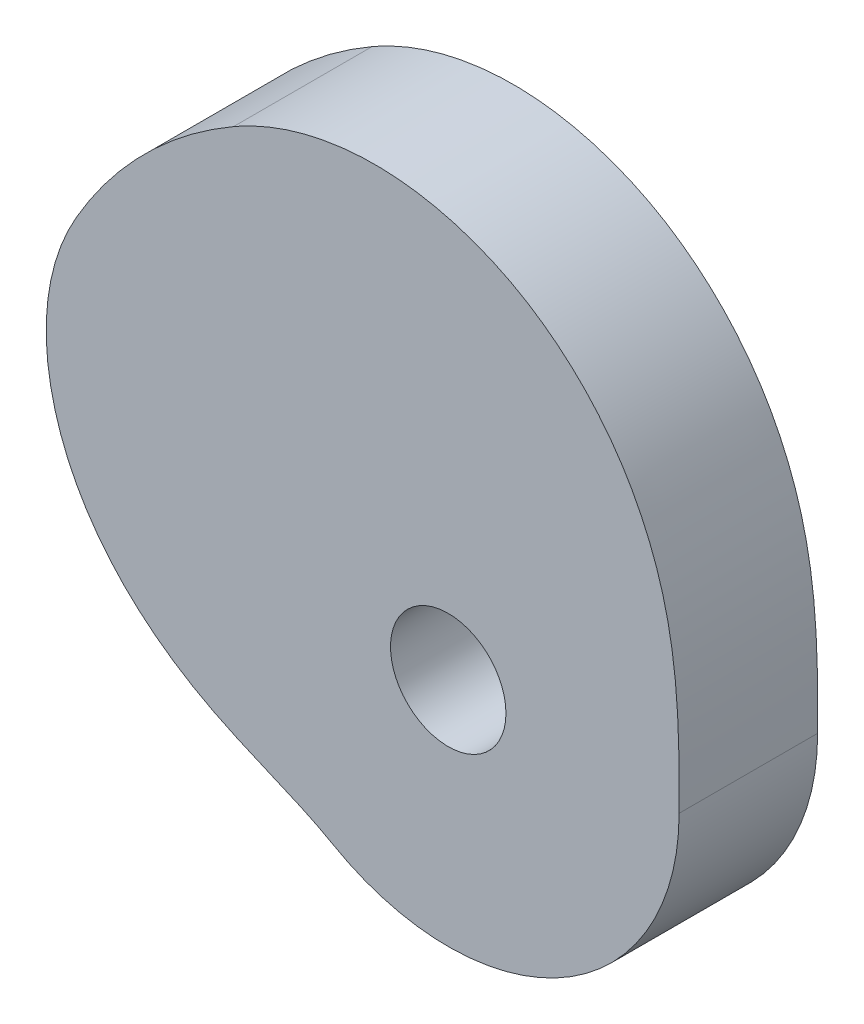
ISO-10303-21;
HEADER;
FILE_DESCRIPTION(('STEP AP214'),'2;1');
FILE_NAME('part.step','',(''),(''),'','','');
FILE_SCHEMA(('AUTOMOTIVE_DESIGN { 1 0 10303 214 1 1 1 1 }'));
ENDSEC;
DATA;
#1=APPLICATION_CONTEXT('core data for automotive mechanical design processes');
#2=APPLICATION_PROTOCOL_DEFINITION('international standard','automotive_design',2000,#1);
#3=PRODUCT_CONTEXT('',#1,'mechanical');
#4=PRODUCT('Part','Part','',(#3));
#5=PRODUCT_RELATED_PRODUCT_CATEGORY('part','',(#4));
#6=PRODUCT_DEFINITION_FORMATION('','',#4);
#7=PRODUCT_DEFINITION_CONTEXT('part definition',#1,'design');
#8=PRODUCT_DEFINITION('design','',#6,#7);
#9=PRODUCT_DEFINITION_SHAPE('','',#8);
#10=(LENGTH_UNIT() NAMED_UNIT(*) SI_UNIT(.MILLI.,.METRE.));
#11=(NAMED_UNIT(*) PLANE_ANGLE_UNIT() SI_UNIT($,.RADIAN.));
#12=(NAMED_UNIT(*) SI_UNIT($,.STERADIAN.) SOLID_ANGLE_UNIT());
#13=UNCERTAINTY_MEASURE_WITH_UNIT(LENGTH_MEASURE(1.E-05),#10,'distance_accuracy_value','');
#14=(GEOMETRIC_REPRESENTATION_CONTEXT(3) GLOBAL_UNCERTAINTY_ASSIGNED_CONTEXT((#13)) GLOBAL_UNIT_ASSIGNED_CONTEXT((#10,
#11,#12)) REPRESENTATION_CONTEXT('',''));
#15=CARTESIAN_POINT('',(0.,0.,0.));
#16=DIRECTION('',(0.,0.,1.));
#17=DIRECTION('',(1.,0.,0.));
#18=AXIS2_PLACEMENT_3D('',#15,#16,#17);
#19=CARTESIAN_POINT('',(-75.6724762193401,-11.0529201440762,15.));
#20=DIRECTION('',(0.,0.,-1.));
#21=DIRECTION('',(-1.,0.,0.));
#22=AXIS2_PLACEMENT_3D('',#19,#20,#21);
#23=PLANE('',#22);
#24=CARTESIAN_POINT('',(-80.5403625519527,46.5000000000002,15.));
#25=CARTESIAN_POINT('',(-84.6777395748458,39.3338527862812,15.));
#26=CARTESIAN_POINT('',(-88.9848075211832,23.5080555781199,15.));
#27=CARTESIAN_POINT('',(-83.9034959357239,-0.39881106507927,15.));
#28=CARTESIAN_POINT('',(-70.4572827205285,-18.8130241369961,15.));
#29=CARTESIAN_POINT('',(-53.9324460222604,-30.4107986291147,15.));
#30=CARTESIAN_POINT('',(-38.3136868979747,-36.9705039453287,15.));
#31=CARTESIAN_POINT('',(-28.9700107117014,-41.0091834361354,15.));
#32=CARTESIAN_POINT('',(-24.9999999999999,-43.301270189222,15.));
#33=B_SPLINE_CURVE_WITH_KNOTS('',3,(#24,#25,#26,#27,#28,#29,#30,#31,#32),.UNSPECIFIED.,.F.,.F.,
(4,1,1,1,1,1,4),(0.,0.198313598511108,0.394495842318221,0.581696629456006,0.748830998503741,
0.886895994021213,1.),.UNSPECIFIED.);
#34=CARTESIAN_POINT('',(-80.5403625519527,46.5000000000002,15.));
#35=VERTEX_POINT('',#34);
#36=CARTESIAN_POINT('',(-24.9999999999999,-43.301270189222,15.));
#37=VERTEX_POINT('',#36);
#38=EDGE_CURVE('E91',#35,#37,#33,.T.);
#39=ORIENTED_EDGE('',*,*,#38,.T.);
#40=CARTESIAN_POINT('',(0.,0.,15.));
#41=DIRECTION('',(0.,0.,1.));
#42=DIRECTION('',(1.,0.,0.));
#43=AXIS2_PLACEMENT_3D('',#40,#41,#42);
#44=CIRCLE('',#43,50.);
#45=CARTESIAN_POINT('',(50.,0.,15.));
#46=VERTEX_POINT('',#45);
#47=EDGE_CURVE('E86',#37,#46,#44,.T.);
#48=ORIENTED_EDGE('',*,*,#47,.T.);
#49=CARTESIAN_POINT('',(50.,0.,15.));
#50=CARTESIAN_POINT('',(50.,5.97437889984434,15.));
#51=CARTESIAN_POINT('',(50.0602048054999,19.1534669007537,15.));
#52=CARTESIAN_POINT('',(47.3363065155835,40.6296986888397,15.));
#53=CARTESIAN_POINT('',(36.6055504452677,63.9257067759154,15.));
#54=CARTESIAN_POINT('',(14.8377653479084,83.4793786198832,15.));
#55=CARTESIAN_POINT('',(-16.0361513166541,91.5003590532724,15.));
#56=CARTESIAN_POINT('',(-37.0281449755582,86.0089406000394,15.));
#57=CARTESIAN_POINT('',(-46.4999999999996,80.5403625519531,15.));
#58=B_SPLINE_CURVE_WITH_KNOTS('',3,(#49,#50,#51,#52,#53,#54,#55,#56,#57),.UNSPECIFIED.,.F.,.F.,
(4,1,1,1,1,1,4),(0.,0.115850128195325,0.25162034264754,0.413575869115293,0.597518573443203,
0.795537986530592,1.),.UNSPECIFIED.);
#59=CARTESIAN_POINT('',(-46.4999999999996,80.5403625519531,15.));
#60=VERTEX_POINT('',#59);
#61=EDGE_CURVE('E89',#46,#60,#58,.T.);
#62=ORIENTED_EDGE('',*,*,#61,.T.);
#63=CARTESIAN_POINT('',(0.,0.,15.));
#64=DIRECTION('',(0.,0.,1.));
#65=DIRECTION('',(-1.,0.,0.));
#66=AXIS2_PLACEMENT_3D('',#63,#64,#65);
#67=CIRCLE('',#66,93.);
#68=EDGE_CURVE('E56',#60,#35,#67,.T.);
#69=ORIENTED_EDGE('',*,*,#68,.T.);
#70=EDGE_LOOP('',(#39,#48,#62,#69));
#71=FACE_BOUND('',#70,.T.);
#72=CARTESIAN_POINT('',(0.,0.,15.));
#73=DIRECTION('',(0.,0.,1.));
#74=DIRECTION('',(1.,0.,0.));
#75=AXIS2_PLACEMENT_3D('',#72,#73,#74);
#76=CIRCLE('',#75,12.5);
#77=CARTESIAN_POINT('',(12.5,0.,15.));
#78=VERTEX_POINT('',#77);
#79=EDGE_CURVE('E135',#78,#78,#76,.T.);
#80=ORIENTED_EDGE('',*,*,#79,.F.);
#81=EDGE_LOOP('',(#80));
#82=FACE_BOUND('',#81,.T.);
#83=ADVANCED_FACE('F38',(#71,#82),#23,.F.);
#84=CARTESIAN_POINT('',(-75.6724762193401,-11.0529201440762,-15.));
#85=DIRECTION('',(0.,0.,-1.));
#86=DIRECTION('',(-1.,0.,0.));
#87=AXIS2_PLACEMENT_3D('',#84,#85,#86);
#88=PLANE('',#87);
#89=CARTESIAN_POINT('',(-80.5403625519527,46.5000000000002,-15.));
#90=CARTESIAN_POINT('',(-84.6777395748458,39.3338527862812,-15.));
#91=CARTESIAN_POINT('',(-88.9848075211832,23.5080555781199,-15.));
#92=CARTESIAN_POINT('',(-83.9034959357239,-0.39881106507927,-15.));
#93=CARTESIAN_POINT('',(-70.4572827205285,-18.8130241369961,-15.));
#94=CARTESIAN_POINT('',(-53.9324460222604,-30.4107986291147,-15.));
#95=CARTESIAN_POINT('',(-38.3136868979747,-36.9705039453287,-15.));
#96=CARTESIAN_POINT('',(-28.9700107117014,-41.0091834361354,-15.));
#97=CARTESIAN_POINT('',(-24.9999999999999,-43.301270189222,-15.));
#98=B_SPLINE_CURVE_WITH_KNOTS('',3,(#89,#90,#91,#92,#93,#94,#95,#96,#97),.UNSPECIFIED.,.F.,.F.,
(4,1,1,1,1,1,4),(0.,0.198313598511108,0.394495842318221,0.581696629456006,0.748830998503741,
0.886895994021213,1.),.UNSPECIFIED.);
#99=CARTESIAN_POINT('',(-80.5403625519527,46.5000000000002,-15.));
#100=VERTEX_POINT('',#99);
#101=CARTESIAN_POINT('',(-24.9999999999999,-43.301270189222,-15.));
#102=VERTEX_POINT('',#101);
#103=EDGE_CURVE('E141',#100,#102,#98,.T.);
#104=ORIENTED_EDGE('',*,*,#103,.F.);
#105=CARTESIAN_POINT('',(0.,0.,-15.));
#106=DIRECTION('',(0.,0.,1.));
#107=DIRECTION('',(-1.,0.,0.));
#108=AXIS2_PLACEMENT_3D('',#105,#106,#107);
#109=CIRCLE('',#108,93.);
#110=CARTESIAN_POINT('',(-46.4999999999996,80.5403625519531,-15.));
#111=VERTEX_POINT('',#110);
#112=EDGE_CURVE('E79',#111,#100,#109,.T.);
#113=ORIENTED_EDGE('',*,*,#112,.F.);
#114=CARTESIAN_POINT('',(50.,0.,-15.));
#115=CARTESIAN_POINT('',(50.,5.97437889984434,-15.));
#116=CARTESIAN_POINT('',(50.0602048054999,19.1534669007537,-15.));
#117=CARTESIAN_POINT('',(47.3363065155835,40.6296986888397,-15.));
#118=CARTESIAN_POINT('',(36.6055504452677,63.9257067759154,-15.));
#119=CARTESIAN_POINT('',(14.8377653479084,83.4793786198832,-15.));
#120=CARTESIAN_POINT('',(-16.0361513166541,91.5003590532724,-15.));
#121=CARTESIAN_POINT('',(-37.0281449755582,86.0089406000394,-15.));
#122=CARTESIAN_POINT('',(-46.4999999999996,80.5403625519531,-15.));
#123=B_SPLINE_CURVE_WITH_KNOTS('',3,(#114,#115,#116,#117,#118,#119,#120,#121,#122),
.UNSPECIFIED.,.F.,.F.,(4,1,1,1,1,1,4),(0.,0.115850128195325,0.25162034264754,0.413575869115293,
0.597518573443203,0.795537986530592,1.),.UNSPECIFIED.);
#124=CARTESIAN_POINT('',(50.,0.,-15.));
#125=VERTEX_POINT('',#124);
#126=EDGE_CURVE('E73',#125,#111,#123,.T.);
#127=ORIENTED_EDGE('',*,*,#126,.F.);
#128=CARTESIAN_POINT('',(0.,0.,-15.));
#129=DIRECTION('',(0.,0.,1.));
#130=DIRECTION('',(1.,0.,0.));
#131=AXIS2_PLACEMENT_3D('',#128,#129,#130);
#132=CIRCLE('',#131,50.);
#133=EDGE_CURVE('E95',#102,#125,#132,.T.);
#134=ORIENTED_EDGE('',*,*,#133,.F.);
#135=EDGE_LOOP('',(#104,#113,#127,#134));
#136=FACE_BOUND('',#135,.T.);
#137=CARTESIAN_POINT('',(0.,0.,-15.));
#138=DIRECTION('',(0.,0.,1.));
#139=DIRECTION('',(1.,0.,0.));
#140=AXIS2_PLACEMENT_3D('',#137,#138,#139);
#141=CIRCLE('',#140,12.5);
#142=CARTESIAN_POINT('',(12.5,0.,-15.));
#143=VERTEX_POINT('',#142);
#144=EDGE_CURVE('E138',#143,#143,#141,.T.);
#145=ORIENTED_EDGE('',*,*,#144,.T.);
#146=EDGE_LOOP('',(#145));
#147=FACE_BOUND('',#146,.T.);
#148=ADVANCED_FACE('F117',(#136,#147),#88,.T.);
#149=DIRECTION('',(0.,0.,-1.));
#150=VECTOR('',#149,1.);
#151=SURFACE_OF_LINEAR_EXTRUSION('',#33,#150);
#152=ORIENTED_EDGE('',*,*,#103,.T.);
#153=DIRECTION('',(0.,0.,-1.));
#154=VECTOR('',#153,1.);
#155=CARTESIAN_POINT('',(-24.9999999999999,-43.301270189222,15.));
#156=LINE('',#155,#154);
#157=EDGE_CURVE('E11',#37,#102,#156,.T.);
#158=ORIENTED_EDGE('',*,*,#157,.F.);
#159=ORIENTED_EDGE('',*,*,#38,.F.);
#160=DIRECTION('',(0.,0.,-1.));
#161=VECTOR('',#160,1.);
#162=CARTESIAN_POINT('',(-80.5403625519527,46.5000000000002,15.));
#163=LINE('',#162,#161);
#164=EDGE_CURVE('E99',#35,#100,#163,.T.);
#165=ORIENTED_EDGE('',*,*,#164,.T.);
#166=EDGE_LOOP('',(#152,#158,#159,#165));
#167=FACE_BOUND('',#166,.T.);
#168=ADVANCED_FACE('F40',(#167),#151,.F.);
#169=CARTESIAN_POINT('',(0.,0.,15.));
#170=DIRECTION('',(0.,0.,-1.));
#171=DIRECTION('',(-1.,0.,0.));
#172=AXIS2_PLACEMENT_3D('',#169,#170,#171);
#173=CYLINDRICAL_SURFACE('',#172,50.);
#174=ORIENTED_EDGE('',*,*,#133,.T.);
#175=DIRECTION('',(0.,0.,-1.));
#176=VECTOR('',#175,1.);
#177=CARTESIAN_POINT('',(50.,0.,15.));
#178=LINE('',#177,#176);
#179=EDGE_CURVE('E48',#46,#125,#178,.T.);
#180=ORIENTED_EDGE('',*,*,#179,.F.);
#181=ORIENTED_EDGE('',*,*,#47,.F.);
#182=ORIENTED_EDGE('',*,*,#157,.T.);
#183=EDGE_LOOP('',(#174,#180,#181,#182));
#184=FACE_BOUND('',#183,.T.);
#185=ADVANCED_FACE('F94',(#184),#173,.T.);
#186=DIRECTION('',(0.,0.,-1.));
#187=VECTOR('',#186,1.);
#188=SURFACE_OF_LINEAR_EXTRUSION('',#58,#187);
#189=ORIENTED_EDGE('',*,*,#126,.T.);
#190=DIRECTION('',(0.,0.,-1.));
#191=VECTOR('',#190,1.);
#192=CARTESIAN_POINT('',(-46.4999999999996,80.5403625519531,15.));
#193=LINE('',#192,#191);
#194=EDGE_CURVE('E96',#60,#111,#193,.T.);
#195=ORIENTED_EDGE('',*,*,#194,.F.);
#196=ORIENTED_EDGE('',*,*,#61,.F.);
#197=ORIENTED_EDGE('',*,*,#179,.T.);
#198=EDGE_LOOP('',(#189,#195,#196,#197));
#199=FACE_BOUND('',#198,.T.);
#200=ADVANCED_FACE('F97',(#199),#188,.F.);
#201=CARTESIAN_POINT('',(0.,0.,15.));
#202=DIRECTION('',(0.,0.,-1.));
#203=DIRECTION('',(-1.,0.,0.));
#204=AXIS2_PLACEMENT_3D('',#201,#202,#203);
#205=CYLINDRICAL_SURFACE('',#204,93.);
#206=ORIENTED_EDGE('',*,*,#112,.T.);
#207=ORIENTED_EDGE('',*,*,#164,.F.);
#208=ORIENTED_EDGE('',*,*,#68,.F.);
#209=ORIENTED_EDGE('',*,*,#194,.T.);
#210=EDGE_LOOP('',(#206,#207,#208,#209));
#211=FACE_BOUND('',#210,.T.);
#212=ADVANCED_FACE('F111',(#211),#205,.T.);
#213=CARTESIAN_POINT('',(0.,0.,15.));
#214=DIRECTION('',(0.,0.,-1.));
#215=DIRECTION('',(-1.,0.,0.));
#216=AXIS2_PLACEMENT_3D('',#213,#214,#215);
#217=CYLINDRICAL_SURFACE('',#216,12.5);
#218=ORIENTED_EDGE('',*,*,#79,.T.);
#219=EDGE_LOOP('',(#218));
#220=FACE_BOUND('',#219,.T.);
#221=ORIENTED_EDGE('',*,*,#144,.F.);
#222=EDGE_LOOP('',(#221));
#223=FACE_BOUND('',#222,.T.);
#224=ADVANCED_FACE('F126',(#220,#223),#217,.F.);
#225=CLOSED_SHELL('',(#83,#148,#168,#185,#200,#212,#224));
#226=MANIFOLD_SOLID_BREP('B2',#225);
#227=ADVANCED_BREP_SHAPE_REPRESENTATION('',(#18,#226),#14);
#228=SHAPE_DEFINITION_REPRESENTATION(#9,#227);
ENDSEC;
END-ISO-10303-21;
